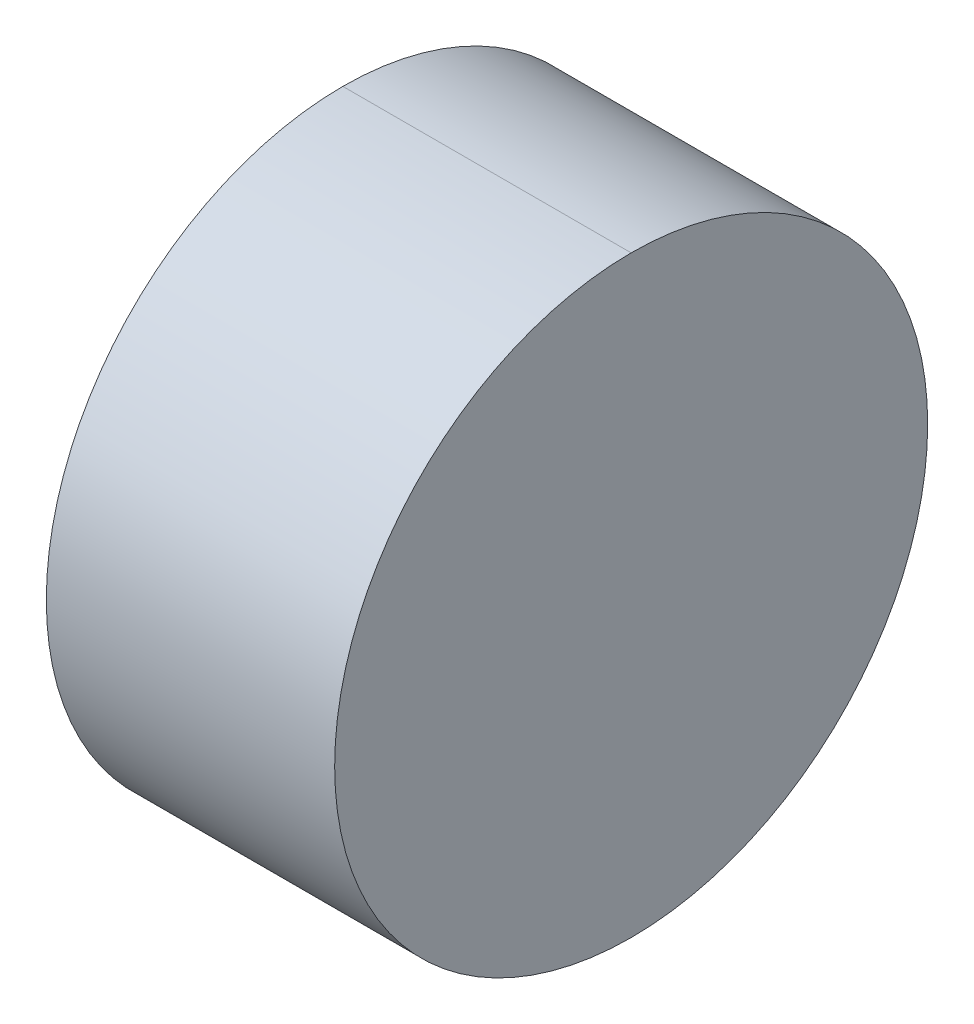
ISO-10303-21;
HEADER;
FILE_DESCRIPTION(('STEP AP214'),'2;1');
FILE_NAME('part.step','',(''),(''),'','','');
FILE_SCHEMA(('AUTOMOTIVE_DESIGN { 1 0 10303 214 1 1 1 1 }'));
ENDSEC;
DATA;
#1=APPLICATION_CONTEXT('core data for automotive mechanical design processes');
#2=APPLICATION_PROTOCOL_DEFINITION('international standard','automotive_design',2000,#1);
#3=PRODUCT_CONTEXT('',#1,'mechanical');
#4=PRODUCT('Part','Part','',(#3));
#5=PRODUCT_RELATED_PRODUCT_CATEGORY('part','',(#4));
#6=PRODUCT_DEFINITION_FORMATION('','',#4);
#7=PRODUCT_DEFINITION_CONTEXT('part definition',#1,'design');
#8=PRODUCT_DEFINITION('design','',#6,#7);
#9=PRODUCT_DEFINITION_SHAPE('','',#8);
#10=(LENGTH_UNIT() NAMED_UNIT(*) SI_UNIT(.MILLI.,.METRE.));
#11=(NAMED_UNIT(*) PLANE_ANGLE_UNIT() SI_UNIT($,.RADIAN.));
#12=(NAMED_UNIT(*) SI_UNIT($,.STERADIAN.) SOLID_ANGLE_UNIT());
#13=UNCERTAINTY_MEASURE_WITH_UNIT(LENGTH_MEASURE(1.E-05),#10,'distance_accuracy_value','');
#14=(GEOMETRIC_REPRESENTATION_CONTEXT(3) GLOBAL_UNCERTAINTY_ASSIGNED_CONTEXT((#13)) GLOBAL_UNIT_ASSIGNED_CONTEXT((#10,
#11,#12)) REPRESENTATION_CONTEXT('',''));
#15=CARTESIAN_POINT('',(0.,0.,0.));
#16=DIRECTION('',(0.,0.,1.));
#17=DIRECTION('',(1.,0.,0.));
#18=AXIS2_PLACEMENT_3D('',#15,#16,#17);
#19=CARTESIAN_POINT('',(150.15236193664,50.41184960215,3.999999831912));
#20=DIRECTION('',(-1.,-4.37113882867399E-08,4.37114091299599E-08));
#21=DIRECTION('',(-4.371138828674E-08,1.,0.));
#22=AXIS2_PLACEMENT_3D('',#19,#20,#21);
#23=PLANE('',#22);
#24=CARTESIAN_POINT('',(150.15236193664,50.41184960215,3.999999831912));
#25=DIRECTION('',(-1.,-4.37113882867399E-08,4.371140912996E-08));
#26=DIRECTION('',(4.371138828674E-08,-1.,0.));
#27=AXIS2_PLACEMENT_3D('',#24,#25,#26);
#28=CIRCLE('',#27,1.75000000014);
#29=CARTESIAN_POINT('',(150.15236201313,48.661849602011,3.999999831912));
#30=VERTEX_POINT('',#29);
#31=CARTESIAN_POINT('',(150.15236186014,52.16184960229,3.999999831912));
#32=VERTEX_POINT('',#31);
#33=EDGE_CURVE('E11',#30,#32,#28,.T.);
#34=ORIENTED_EDGE('',*,*,#33,.F.);
#35=CARTESIAN_POINT('',(150.15236193664,50.41184960215,3.999999831912));
#36=DIRECTION('',(-1.,-4.37113882867399E-08,4.371140912996E-08));
#37=DIRECTION('',(4.371138828674E-08,-1.,0.));
#38=AXIS2_PLACEMENT_3D('',#35,#36,#37);
#39=CIRCLE('',#38,1.75000000014);
#40=EDGE_CURVE('E58',#32,#30,#39,.T.);
#41=ORIENTED_EDGE('',*,*,#40,.F.);
#42=EDGE_LOOP('',(#34,#41));
#43=FACE_BOUND('',#42,.T.);
#44=ADVANCED_FACE('F16',(#43),#23,.F.);
#45=CARTESIAN_POINT('',(150.15236193664,50.41184960215,3.999999831912));
#46=DIRECTION('',(-1.,-4.37113882867399E-08,4.371140912996E-08));
#47=DIRECTION('',(4.371138828674E-08,-1.,0.));
#48=AXIS2_PLACEMENT_3D('',#45,#46,#47);
#49=CYLINDRICAL_SURFACE('',#48,1.75000000014);
#50=ORIENTED_EDGE('',*,*,#33,.T.);
#51=DIRECTION('',(-1.,-4.37113882867399E-08,4.37114091299599E-08));
#52=VECTOR('',#51,1.);
#53=CARTESIAN_POINT('',(150.15236186014,52.16184960229,3.999999831912));
#54=LINE('',#53,#52);
#55=CARTESIAN_POINT('',(148.45056186014,52.161849527902,3.9999999063));
#56=VERTEX_POINT('',#55);
#57=EDGE_CURVE('E20',#32,#56,#54,.T.);
#58=ORIENTED_EDGE('',*,*,#57,.T.);
#59=CARTESIAN_POINT('',(148.45056193664,50.411849527762,3.9999999063));
#60=DIRECTION('',(-1.,-4.37113882867399E-08,4.371140912996E-08));
#61=DIRECTION('',(4.371138828674E-08,-1.,0.));
#62=AXIS2_PLACEMENT_3D('',#59,#60,#61);
#63=CIRCLE('',#62,1.75000000014);
#64=CARTESIAN_POINT('',(148.45056201313,48.661849527623,3.9999999063));
#65=VERTEX_POINT('',#64);
#66=EDGE_CURVE('E64',#65,#56,#63,.T.);
#67=ORIENTED_EDGE('',*,*,#66,.F.);
#68=DIRECTION('',(-1.,-4.37113882867399E-08,4.37114091299599E-08));
#69=VECTOR('',#68,1.);
#70=CARTESIAN_POINT('',(150.15236201313,48.661849602011,3.999999831912));
#71=LINE('',#70,#69);
#72=EDGE_CURVE('E26',#30,#65,#71,.T.);
#73=ORIENTED_EDGE('',*,*,#72,.F.);
#74=EDGE_LOOP('',(#50,#58,#67,#73));
#75=FACE_BOUND('',#74,.T.);
#76=ADVANCED_FACE('F18',(#75),#49,.T.);
#77=CARTESIAN_POINT('',(150.15236193664,50.41184960215,3.999999831912));
#78=DIRECTION('',(-1.,-4.37113882867399E-08,4.371140912996E-08));
#79=DIRECTION('',(4.371138828674E-08,-1.,0.));
#80=AXIS2_PLACEMENT_3D('',#77,#78,#79);
#81=CYLINDRICAL_SURFACE('',#80,1.75000000014);
#82=ORIENTED_EDGE('',*,*,#57,.F.);
#83=ORIENTED_EDGE('',*,*,#40,.T.);
#84=ORIENTED_EDGE('',*,*,#72,.T.);
#85=CARTESIAN_POINT('',(148.45056193664,50.411849527762,3.9999999063));
#86=DIRECTION('',(-1.,-4.37113882867399E-08,4.371140912996E-08));
#87=DIRECTION('',(4.371138828674E-08,-1.,0.));
#88=AXIS2_PLACEMENT_3D('',#85,#86,#87);
#89=CIRCLE('',#88,1.75000000014);
#90=EDGE_CURVE('E56',#56,#65,#89,.T.);
#91=ORIENTED_EDGE('',*,*,#90,.F.);
#92=EDGE_LOOP('',(#82,#83,#84,#91));
#93=FACE_BOUND('',#92,.T.);
#94=ADVANCED_FACE('F55',(#93),#81,.T.);
#95=CARTESIAN_POINT('',(148.45056193664,50.411849527762,3.9999999063));
#96=DIRECTION('',(-1.,-4.37113882867399E-08,4.37114091299599E-08));
#97=DIRECTION('',(-4.371138828674E-08,1.,0.));
#98=AXIS2_PLACEMENT_3D('',#95,#96,#97);
#99=PLANE('',#98);
#100=ORIENTED_EDGE('',*,*,#66,.T.);
#101=ORIENTED_EDGE('',*,*,#90,.T.);
#102=EDGE_LOOP('',(#100,#101));
#103=FACE_BOUND('',#102,.T.);
#104=ADVANCED_FACE('F63',(#103),#99,.T.);
#105=CLOSED_SHELL('',(#44,#76,#94,#104));
#106=MANIFOLD_SOLID_BREP('B1',#105);
#107=ADVANCED_BREP_SHAPE_REPRESENTATION('',(#18,#106),#14);
#108=SHAPE_DEFINITION_REPRESENTATION(#9,#107);
ENDSEC;
END-ISO-10303-21;
